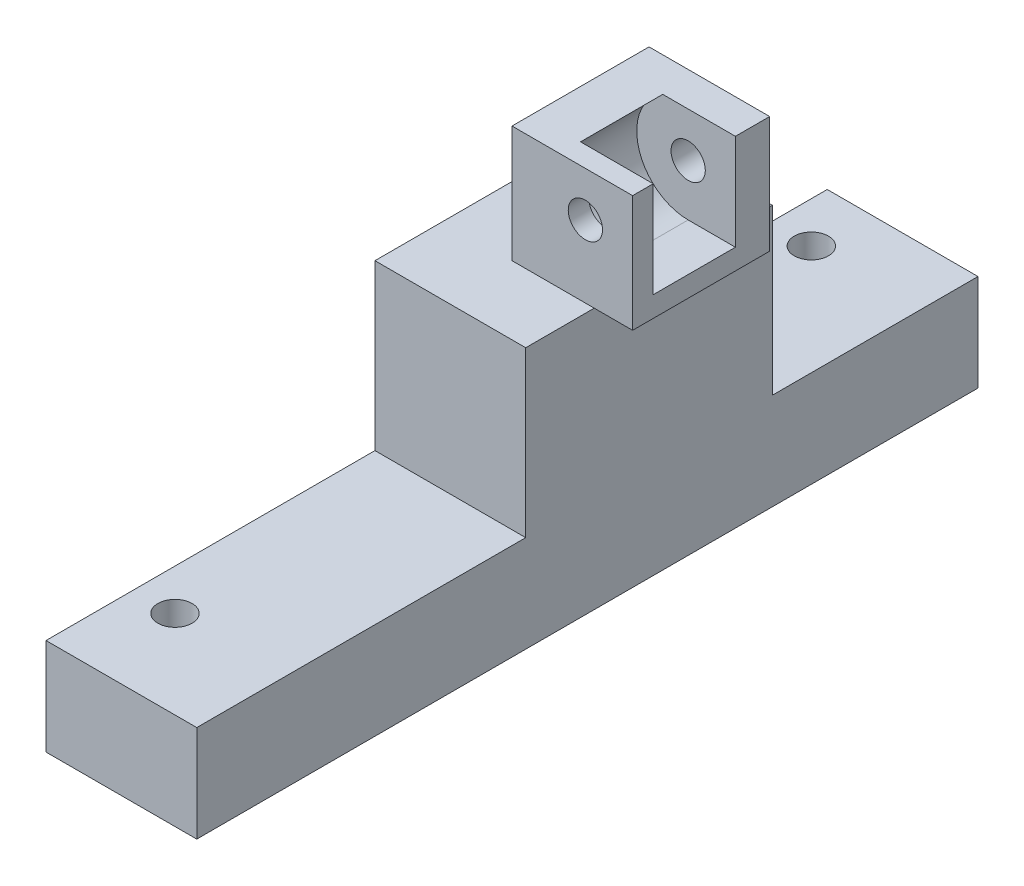
ISO-10303-21;
HEADER;
FILE_DESCRIPTION(('STEP AP214'),'2;1');
FILE_NAME('part.step','',(''),(''),'','','');
FILE_SCHEMA(('AUTOMOTIVE_DESIGN { 1 0 10303 214 1 1 1 1 }'));
ENDSEC;
DATA;
#1=APPLICATION_CONTEXT('core data for automotive mechanical design processes');
#2=APPLICATION_PROTOCOL_DEFINITION('international standard','automotive_design',2000,#1);
#3=PRODUCT_CONTEXT('',#1,'mechanical');
#4=PRODUCT('Part','Part','',(#3));
#5=PRODUCT_RELATED_PRODUCT_CATEGORY('part','',(#4));
#6=PRODUCT_DEFINITION_FORMATION('','',#4);
#7=PRODUCT_DEFINITION_CONTEXT('part definition',#1,'design');
#8=PRODUCT_DEFINITION('design','',#6,#7);
#9=PRODUCT_DEFINITION_SHAPE('','',#8);
#10=(LENGTH_UNIT() NAMED_UNIT(*) SI_UNIT(.MILLI.,.METRE.));
#11=(NAMED_UNIT(*) PLANE_ANGLE_UNIT() SI_UNIT($,.RADIAN.));
#12=(NAMED_UNIT(*) SI_UNIT($,.STERADIAN.) SOLID_ANGLE_UNIT());
#13=UNCERTAINTY_MEASURE_WITH_UNIT(LENGTH_MEASURE(1.E-05),#10,'distance_accuracy_value','');
#14=(GEOMETRIC_REPRESENTATION_CONTEXT(3) GLOBAL_UNCERTAINTY_ASSIGNED_CONTEXT((#13)) GLOBAL_UNIT_ASSIGNED_CONTEXT((#10,
#11,#12)) REPRESENTATION_CONTEXT('',''));
#15=CARTESIAN_POINT('',(0.,0.,0.));
#16=DIRECTION('',(0.,0.,1.));
#17=DIRECTION('',(1.,0.,0.));
#18=AXIS2_PLACEMENT_3D('',#15,#16,#17);
#19=CARTESIAN_POINT('',(0.,352.959436719435,-21.59));
#20=DIRECTION('',(0.,-1.,0.));
#21=DIRECTION('',(0.,0.,-1.));
#22=AXIS2_PLACEMENT_3D('',#19,#20,#21);
#23=PLANE('',#22);
#24=DIRECTION('',(1.,0.,0.));
#25=VECTOR('',#24,1.);
#26=CARTESIAN_POINT('',(-814.935825879218,352.959436719435,3.81));
#27=LINE('',#26,#25);
#28=CARTESIAN_POINT('',(-799.695825879218,352.959436719435,3.80999999999999));
#29=VERTEX_POINT('',#28);
#30=CARTESIAN_POINT('',(-792.583825879217,352.959436719435,3.81));
#31=VERTEX_POINT('',#30);
#32=EDGE_CURVE('E248',#29,#31,#27,.T.);
#33=ORIENTED_EDGE('',*,*,#32,.F.);
#34=DIRECTION('',(0.,0.,-1.));
#35=VECTOR('',#34,1.);
#36=CARTESIAN_POINT('',(-799.695825879218,352.959436719435,77.47));
#37=LINE('',#36,#35);
#38=CARTESIAN_POINT('',(-799.695825879218,352.959436719435,-21.59));
#39=VERTEX_POINT('',#38);
#40=EDGE_CURVE('E176',#29,#39,#37,.T.);
#41=ORIENTED_EDGE('',*,*,#40,.T.);
#42=DIRECTION('',(1.,0.,0.));
#43=VECTOR('',#42,1.);
#44=CARTESIAN_POINT('',(0.,352.959436719435,-21.59));
#45=LINE('',#44,#43);
#46=CARTESIAN_POINT('',(-792.583825879217,352.959436719435,-21.59));
#47=VERTEX_POINT('',#46);
#48=EDGE_CURVE('E280',#39,#47,#45,.T.);
#49=ORIENTED_EDGE('',*,*,#48,.T.);
#50=DIRECTION('',(0.,0.,1.));
#51=VECTOR('',#50,1.);
#52=CARTESIAN_POINT('',(-792.583825879217,352.959436719435,-21.59));
#53=LINE('',#52,#51);
#54=EDGE_CURVE('E302',#47,#31,#53,.T.);
#55=ORIENTED_EDGE('',*,*,#54,.T.);
#56=EDGE_LOOP('',(#33,#41,#49,#55));
#57=FACE_BOUND('',#56,.T.);
#58=ADVANCED_FACE('F47',(#57),#23,.T.);
#59=CARTESIAN_POINT('',(-801.338321143161,366.294436719436,-21.59));
#60=DIRECTION('',(0.,0.,1.));
#61=DIRECTION('',(1.,0.,0.));
#62=AXIS2_PLACEMENT_3D('',#59,#60,#61);
#63=CYLINDRICAL_SURFACE('',#62,9.52500000000037);
#64=CARTESIAN_POINT('',(-801.33832114316,366.294436719435,-15.24));
#65=DIRECTION('',(0.,0.,1.));
#66=DIRECTION('',(1.,0.,0.));
#67=AXIS2_PLACEMENT_3D('',#64,#65,#66);
#68=CIRCLE('',#67,9.52500000000007);
#69=CARTESIAN_POINT('',(-801.33832114316,356.769436719435,-15.24));
#70=VERTEX_POINT('',#69);
#71=CARTESIAN_POINT('',(-806.045825879218,374.574836719435,-15.24));
#72=VERTEX_POINT('',#71);
#73=EDGE_CURVE('E214',#70,#72,#68,.F.);
#74=ORIENTED_EDGE('',*,*,#73,.T.);
#75=DIRECTION('',(0.,0.,1.));
#76=VECTOR('',#75,1.);
#77=CARTESIAN_POINT('',(-806.045825879218,374.574836719435,-21.59));
#78=LINE('',#77,#76);
#79=CARTESIAN_POINT('',(-806.045825879218,374.574836719435,0.));
#80=VERTEX_POINT('',#79);
#81=EDGE_CURVE('E289',#72,#80,#78,.T.);
#82=ORIENTED_EDGE('',*,*,#81,.T.);
#83=CARTESIAN_POINT('',(-801.338321143161,366.294436719436,0.));
#84=DIRECTION('',(0.,0.,1.));
#85=DIRECTION('',(1.,0.,0.));
#86=AXIS2_PLACEMENT_3D('',#83,#84,#85);
#87=CIRCLE('',#86,9.52500000000037);
#88=CARTESIAN_POINT('',(-801.33832114316,356.769436719435,0.));
#89=VERTEX_POINT('',#88);
#90=EDGE_CURVE('E270',#89,#80,#87,.F.);
#91=ORIENTED_EDGE('',*,*,#90,.F.);
#92=DIRECTION('',(0.,0.,1.));
#93=VECTOR('',#92,1.);
#94=CARTESIAN_POINT('',(-801.33832114316,356.769436719435,-21.59));
#95=LINE('',#94,#93);
#96=EDGE_CURVE('E296',#70,#89,#95,.T.);
#97=ORIENTED_EDGE('',*,*,#96,.F.);
#98=EDGE_LOOP('',(#74,#82,#91,#97));
#99=FACE_BOUND('',#98,.T.);
#100=ADVANCED_FACE('F49',(#99),#63,.F.);
#101=CARTESIAN_POINT('',(0.,356.769436719435,-21.59));
#102=DIRECTION('',(0.,1.,0.));
#103=DIRECTION('',(0.,0.,1.));
#104=AXIS2_PLACEMENT_3D('',#101,#102,#103);
#105=PLANE('',#104);
#106=DIRECTION('',(-1.,0.,0.));
#107=VECTOR('',#106,1.);
#108=CARTESIAN_POINT('',(-792.583825879217,356.769436719435,-15.24));
#109=LINE('',#108,#107);
#110=CARTESIAN_POINT('',(-792.583825879217,356.769436719435,-15.24));
#111=VERTEX_POINT('',#110);
#112=EDGE_CURVE('E222',#111,#70,#109,.T.);
#113=ORIENTED_EDGE('',*,*,#112,.T.);
#114=ORIENTED_EDGE('',*,*,#96,.T.);
#115=DIRECTION('',(-1.,0.,0.));
#116=VECTOR('',#115,1.);
#117=CARTESIAN_POINT('',(0.,356.769436719435,0.));
#118=LINE('',#117,#116);
#119=CARTESIAN_POINT('',(-792.583825879217,356.769436719435,0.));
#120=VERTEX_POINT('',#119);
#121=EDGE_CURVE('E276',#120,#89,#118,.T.);
#122=ORIENTED_EDGE('',*,*,#121,.F.);
#123=DIRECTION('',(0.,0.,1.));
#124=VECTOR('',#123,1.);
#125=CARTESIAN_POINT('',(-792.583825879217,356.769436719435,-21.59));
#126=LINE('',#125,#124);
#127=EDGE_CURVE('E299',#111,#120,#126,.T.);
#128=ORIENTED_EDGE('',*,*,#127,.F.);
#129=EDGE_LOOP('',(#113,#114,#122,#128));
#130=FACE_BOUND('',#129,.T.);
#131=ADVANCED_FACE('F445',(#130),#105,.T.);
#132=CARTESIAN_POINT('',(-792.583825879217,0.,-21.59));
#133=DIRECTION('',(-1.,0.,0.));
#134=DIRECTION('',(0.,0.,1.));
#135=AXIS2_PLACEMENT_3D('',#132,#133,#134);
#136=PLANE('',#135);
#137=DIRECTION('',(0.,-1.,0.));
#138=VECTOR('',#137,1.);
#139=CARTESIAN_POINT('',(-792.583825879217,0.,-21.59));
#140=LINE('',#139,#138);
#141=CARTESIAN_POINT('',(-792.583825879217,374.574836719435,-21.59));
#142=VERTEX_POINT('',#141);
#143=EDGE_CURVE('E285',#142,#47,#140,.T.);
#144=ORIENTED_EDGE('',*,*,#143,.F.);
#145=DIRECTION('',(0.,0.,-1.));
#146=VECTOR('',#145,1.);
#147=CARTESIAN_POINT('',(-792.583825879217,374.574836719435,14.0880762649637));
#148=LINE('',#147,#146);
#149=CARTESIAN_POINT('',(-792.583825879217,374.574836719435,-15.24));
#150=VERTEX_POINT('',#149);
#151=EDGE_CURVE('E221',#150,#142,#148,.T.);
#152=ORIENTED_EDGE('',*,*,#151,.F.);
#153=DIRECTION('',(0.,-1.,0.));
#154=VECTOR('',#153,1.);
#155=CARTESIAN_POINT('',(-792.583825879217,356.769436719435,-15.24));
#156=LINE('',#155,#154);
#157=EDGE_CURVE('E225',#150,#111,#156,.T.);
#158=ORIENTED_EDGE('',*,*,#157,.T.);
#159=ORIENTED_EDGE('',*,*,#127,.T.);
#160=DIRECTION('',(0.,1.,0.));
#161=VECTOR('',#160,1.);
#162=CARTESIAN_POINT('',(-792.583825879217,352.959436719435,0.));
#163=LINE('',#162,#161);
#164=CARTESIAN_POINT('',(-792.583825879217,374.574836719435,0.));
#165=VERTEX_POINT('',#164);
#166=EDGE_CURVE('E240',#120,#165,#163,.T.);
#167=ORIENTED_EDGE('',*,*,#166,.T.);
#168=DIRECTION('',(0.,0.,-1.));
#169=VECTOR('',#168,1.);
#170=CARTESIAN_POINT('',(-792.583825879217,374.574836719435,3.81));
#171=LINE('',#170,#169);
#172=CARTESIAN_POINT('',(-792.583825879217,374.574836719435,3.81));
#173=VERTEX_POINT('',#172);
#174=EDGE_CURVE('E261',#173,#165,#171,.T.);
#175=ORIENTED_EDGE('',*,*,#174,.F.);
#176=DIRECTION('',(0.,1.,0.));
#177=VECTOR('',#176,1.);
#178=CARTESIAN_POINT('',(-792.583825879217,352.959436719435,3.81));
#179=LINE('',#178,#177);
#180=EDGE_CURVE('E254',#31,#173,#179,.T.);
#181=ORIENTED_EDGE('',*,*,#180,.F.);
#182=ORIENTED_EDGE('',*,*,#54,.F.);
#183=EDGE_LOOP('',(#144,#152,#158,#159,#167,#175,#181,#182));
#184=FACE_BOUND('',#183,.T.);
#185=ADVANCED_FACE('F449',(#184),#136,.F.);
#186=CARTESIAN_POINT('',(-814.935825879218,0.,-21.59));
#187=DIRECTION('',(-1.,0.,0.));
#188=DIRECTION('',(0.,0.,1.));
#189=AXIS2_PLACEMENT_3D('',#186,#187,#188);
#190=PLANE('',#189);
#191=DIRECTION('',(0.,0.,1.));
#192=VECTOR('',#191,1.);
#193=CARTESIAN_POINT('',(-814.935825879218,352.959436719435,-21.59));
#194=LINE('',#193,#192);
#195=CARTESIAN_POINT('',(-814.935825879218,352.959436719435,-21.59));
#196=VERTEX_POINT('',#195);
#197=CARTESIAN_POINT('',(-814.935825879218,352.959436719435,3.81));
#198=VERTEX_POINT('',#197);
#199=EDGE_CURVE('E306',#196,#198,#194,.T.);
#200=ORIENTED_EDGE('',*,*,#199,.T.);
#201=DIRECTION('',(0.,-1.,0.));
#202=VECTOR('',#201,1.);
#203=CARTESIAN_POINT('',(-814.935825879218,352.959436719435,3.81));
#204=LINE('',#203,#202);
#205=CARTESIAN_POINT('',(-814.935825879218,374.574836719435,3.81));
#206=VERTEX_POINT('',#205);
#207=EDGE_CURVE('E244',#206,#198,#204,.T.);
#208=ORIENTED_EDGE('',*,*,#207,.F.);
#209=DIRECTION('',(0.,0.,1.));
#210=VECTOR('',#209,1.);
#211=CARTESIAN_POINT('',(-814.935825879218,374.574836719435,-21.59));
#212=LINE('',#211,#210);
#213=CARTESIAN_POINT('',(-814.935825879218,374.574836719435,-21.59));
#214=VERTEX_POINT('',#213);
#215=EDGE_CURVE('E310',#214,#206,#212,.T.);
#216=ORIENTED_EDGE('',*,*,#215,.F.);
#217=DIRECTION('',(0.,-1.,0.));
#218=VECTOR('',#217,1.);
#219=CARTESIAN_POINT('',(-814.935825879218,0.,-21.59));
#220=LINE('',#219,#218);
#221=EDGE_CURVE('E275',#214,#196,#220,.T.);
#222=ORIENTED_EDGE('',*,*,#221,.T.);
#223=EDGE_LOOP('',(#200,#208,#216,#222));
#224=FACE_BOUND('',#223,.T.);
#225=ADVANCED_FACE('F354',(#224),#190,.T.);
#226=CARTESIAN_POINT('',(0.,374.574836719435,-21.59));
#227=DIRECTION('',(0.,-1.,0.));
#228=DIRECTION('',(0.,0.,-1.));
#229=AXIS2_PLACEMENT_3D('',#226,#227,#228);
#230=PLANE('',#229);
#231=ORIENTED_EDGE('',*,*,#215,.T.);
#232=DIRECTION('',(-1.,0.,0.));
#233=VECTOR('',#232,1.);
#234=CARTESIAN_POINT('',(-814.935825879218,374.574836719435,3.81));
#235=LINE('',#234,#233);
#236=EDGE_CURVE('E257',#173,#206,#235,.T.);
#237=ORIENTED_EDGE('',*,*,#236,.F.);
#238=ORIENTED_EDGE('',*,*,#174,.T.);
#239=DIRECTION('',(-1.,0.,0.));
#240=VECTOR('',#239,1.);
#241=CARTESIAN_POINT('',(-814.935825879218,374.574836719435,0.));
#242=LINE('',#241,#240);
#243=EDGE_CURVE('E249',#165,#80,#242,.T.);
#244=ORIENTED_EDGE('',*,*,#243,.T.);
#245=ORIENTED_EDGE('',*,*,#81,.F.);
#246=DIRECTION('',(1.,0.,0.));
#247=VECTOR('',#246,1.);
#248=CARTESIAN_POINT('',(-792.583825879217,374.574836719435,-15.24));
#249=LINE('',#248,#247);
#250=EDGE_CURVE('E229',#72,#150,#249,.T.);
#251=ORIENTED_EDGE('',*,*,#250,.T.);
#252=ORIENTED_EDGE('',*,*,#151,.T.);
#253=DIRECTION('',(1.,0.,0.));
#254=VECTOR('',#253,1.);
#255=CARTESIAN_POINT('',(0.,374.574836719435,-21.59));
#256=LINE('',#255,#254);
#257=EDGE_CURVE('E271',#214,#142,#256,.T.);
#258=ORIENTED_EDGE('',*,*,#257,.F.);
#259=EDGE_LOOP('',(#231,#237,#238,#244,#245,#251,#252,#258));
#260=FACE_BOUND('',#259,.T.);
#261=ADVANCED_FACE('F451',(#260),#230,.F.);
#262=CARTESIAN_POINT('',(0.,0.,-21.59));
#263=DIRECTION('',(0.,0.,1.));
#264=DIRECTION('',(1.,0.,0.));
#265=AXIS2_PLACEMENT_3D('',#262,#263,#264);
#266=PLANE('',#265);
#267=ORIENTED_EDGE('',*,*,#257,.T.);
#268=ORIENTED_EDGE('',*,*,#143,.T.);
#269=ORIENTED_EDGE('',*,*,#48,.F.);
#270=EDGE_CURVE('E281',#196,#39,#45,.T.);
#271=ORIENTED_EDGE('',*,*,#270,.F.);
#272=ORIENTED_EDGE('',*,*,#221,.F.);
#273=EDGE_LOOP('',(#267,#268,#269,#271,#272));
#274=FACE_BOUND('',#273,.T.);
#275=CARTESIAN_POINT('',(-801.33832114316,366.294436719435,-21.59));
#276=DIRECTION('',(0.,0.,-1.));
#277=DIRECTION('',(-1.,0.,0.));
#278=AXIS2_PLACEMENT_3D('',#275,#276,#277);
#279=CIRCLE('',#278,3.17500000000032);
#280=CARTESIAN_POINT('',(-804.513321143161,366.294436719435,-21.59));
#281=VERTEX_POINT('',#280);
#282=EDGE_CURVE('E209',#281,#281,#279,.T.);
#283=ORIENTED_EDGE('',*,*,#282,.F.);
#284=EDGE_LOOP('',(#283));
#285=FACE_BOUND('',#284,.T.);
#286=ADVANCED_FACE('F358',(#274,#285),#266,.F.);
#287=CARTESIAN_POINT('',(0.,0.,3.81));
#288=DIRECTION('',(0.,0.,-1.));
#289=DIRECTION('',(-1.,0.,0.));
#290=AXIS2_PLACEMENT_3D('',#287,#288,#289);
#291=PLANE('',#290);
#292=ORIENTED_EDGE('',*,*,#207,.T.);
#293=EDGE_CURVE('E250',#198,#29,#27,.T.);
#294=ORIENTED_EDGE('',*,*,#293,.T.);
#295=ORIENTED_EDGE('',*,*,#32,.T.);
#296=ORIENTED_EDGE('',*,*,#180,.T.);
#297=ORIENTED_EDGE('',*,*,#236,.T.);
#298=EDGE_LOOP('',(#292,#294,#295,#296,#297));
#299=FACE_BOUND('',#298,.T.);
#300=CARTESIAN_POINT('',(-801.338321143161,366.294436719435,3.81));
#301=DIRECTION('',(0.,0.,1.));
#302=DIRECTION('',(1.,0.,0.));
#303=AXIS2_PLACEMENT_3D('',#300,#301,#302);
#304=CIRCLE('',#303,3.17500000000008);
#305=CARTESIAN_POINT('',(-804.513321143161,366.294436719435,3.81));
#306=VERTEX_POINT('',#305);
#307=EDGE_CURVE('E236',#306,#306,#304,.T.);
#308=ORIENTED_EDGE('',*,*,#307,.F.);
#309=EDGE_LOOP('',(#308));
#310=FACE_BOUND('',#309,.T.);
#311=ADVANCED_FACE('F349',(#299,#310),#291,.F.);
#312=CARTESIAN_POINT('',(0.,0.,0.));
#313=DIRECTION('',(0.,0.,-1.));
#314=DIRECTION('',(-1.,0.,0.));
#315=AXIS2_PLACEMENT_3D('',#312,#313,#314);
#316=PLANE('',#315);
#317=ORIENTED_EDGE('',*,*,#121,.T.);
#318=ORIENTED_EDGE('',*,*,#90,.T.);
#319=ORIENTED_EDGE('',*,*,#243,.F.);
#320=ORIENTED_EDGE('',*,*,#166,.F.);
#321=EDGE_LOOP('',(#317,#318,#319,#320));
#322=FACE_BOUND('',#321,.T.);
#323=CARTESIAN_POINT('',(-801.338321143161,366.294436719435,0.));
#324=DIRECTION('',(0.,0.,1.));
#325=DIRECTION('',(1.,0.,0.));
#326=AXIS2_PLACEMENT_3D('',#323,#324,#325);
#327=CIRCLE('',#326,3.17500000000008);
#328=CARTESIAN_POINT('',(-804.513321143161,366.294436719435,0.));
#329=VERTEX_POINT('',#328);
#330=EDGE_CURVE('E218',#329,#329,#327,.T.);
#331=ORIENTED_EDGE('',*,*,#330,.T.);
#332=EDGE_LOOP('',(#331));
#333=FACE_BOUND('',#332,.T.);
#334=ADVANCED_FACE('F467',(#322,#333),#316,.T.);
#335=CARTESIAN_POINT('',(-801.338321143161,366.294436719435,3.81));
#336=DIRECTION('',(0.,0.,-1.));
#337=DIRECTION('',(-1.,0.,0.));
#338=AXIS2_PLACEMENT_3D('',#335,#336,#337);
#339=CYLINDRICAL_SURFACE('',#338,3.17500000000008);
#340=CARTESIAN_POINT('',(-804.513321143161,366.294436719435,3.81));
#341=CARTESIAN_POINT('',(-804.513321143161,366.294436719435,3.7703125));
#342=CARTESIAN_POINT('',(-804.513321143161,366.294436719435,3.730625));
#343=CARTESIAN_POINT('',(-804.513321143161,366.294436719435,3.65125));
#344=CARTESIAN_POINT('',(-804.513321143161,366.294436719435,3.6115625));
#345=CARTESIAN_POINT('',(-804.513321143161,366.294436719435,3.5321875));
#346=CARTESIAN_POINT('',(-804.513321143161,366.294436719435,3.4925));
#347=CARTESIAN_POINT('',(-804.513321143161,366.294436719435,3.413125));
#348=CARTESIAN_POINT('',(-804.513321143161,366.294436719435,3.3734375));
#349=CARTESIAN_POINT('',(-804.513321143161,366.294436719435,3.2940625));
#350=CARTESIAN_POINT('',(-804.513321143161,366.294436719435,3.254375));
#351=CARTESIAN_POINT('',(-804.513321143161,366.294436719435,3.175));
#352=CARTESIAN_POINT('',(-804.513321143161,366.294436719435,3.1353125));
#353=CARTESIAN_POINT('',(-804.513321143161,366.294436719435,3.0559375));
#354=CARTESIAN_POINT('',(-804.513321143161,366.294436719435,3.01625));
#355=CARTESIAN_POINT('',(-804.513321143161,366.294436719435,2.936875));
#356=CARTESIAN_POINT('',(-804.513321143161,366.294436719435,2.8971875));
#357=CARTESIAN_POINT('',(-804.513321143161,366.294436719435,2.8178125));
#358=CARTESIAN_POINT('',(-804.513321143161,366.294436719435,2.778125));
#359=CARTESIAN_POINT('',(-804.513321143161,366.294436719435,2.69875));
#360=CARTESIAN_POINT('',(-804.513321143161,366.294436719435,2.6590625));
#361=CARTESIAN_POINT('',(-804.513321143161,366.294436719435,2.5796875));
#362=CARTESIAN_POINT('',(-804.513321143161,366.294436719435,2.54));
#363=CARTESIAN_POINT('',(-804.513321143161,366.294436719435,2.460625));
#364=CARTESIAN_POINT('',(-804.513321143161,366.294436719435,2.4209375));
#365=CARTESIAN_POINT('',(-804.513321143161,366.294436719435,2.3415625));
#366=CARTESIAN_POINT('',(-804.513321143161,366.294436719435,2.301875));
#367=CARTESIAN_POINT('',(-804.513321143161,366.294436719435,2.2225));
#368=CARTESIAN_POINT('',(-804.513321143161,366.294436719435,2.1828125));
#369=CARTESIAN_POINT('',(-804.513321143161,366.294436719435,2.1034375));
#370=CARTESIAN_POINT('',(-804.513321143161,366.294436719435,2.06375));
#371=CARTESIAN_POINT('',(-804.513321143161,366.294436719435,1.984375));
#372=CARTESIAN_POINT('',(-804.513321143161,366.294436719435,1.9446875));
#373=CARTESIAN_POINT('',(-804.513321143161,366.294436719435,1.8653125));
#374=CARTESIAN_POINT('',(-804.513321143161,366.294436719435,1.825625));
#375=CARTESIAN_POINT('',(-804.513321143161,366.294436719435,1.74625));
#376=CARTESIAN_POINT('',(-804.513321143161,366.294436719435,1.7065625));
#377=CARTESIAN_POINT('',(-804.513321143161,366.294436719435,1.6271875));
#378=CARTESIAN_POINT('',(-804.513321143161,366.294436719435,1.5875));
#379=CARTESIAN_POINT('',(-804.513321143161,366.294436719435,1.508125));
#380=CARTESIAN_POINT('',(-804.513321143161,366.294436719435,1.4684375));
#381=CARTESIAN_POINT('',(-804.513321143161,366.294436719435,1.3890625));
#382=CARTESIAN_POINT('',(-804.513321143161,366.294436719435,1.349375));
#383=CARTESIAN_POINT('',(-804.513321143161,366.294436719435,1.27));
#384=CARTESIAN_POINT('',(-804.513321143161,366.294436719435,1.2303125));
#385=CARTESIAN_POINT('',(-804.513321143161,366.294436719435,1.1509375));
#386=CARTESIAN_POINT('',(-804.513321143161,366.294436719435,1.11125));
#387=CARTESIAN_POINT('',(-804.513321143161,366.294436719435,1.031875));
#388=CARTESIAN_POINT('',(-804.513321143161,366.294436719435,0.9921875));
#389=CARTESIAN_POINT('',(-804.513321143161,366.294436719435,0.9128125));
#390=CARTESIAN_POINT('',(-804.513321143161,366.294436719435,0.873125));
#391=CARTESIAN_POINT('',(-804.513321143161,366.294436719435,0.79375));
#392=CARTESIAN_POINT('',(-804.513321143161,366.294436719435,0.7540625));
#393=CARTESIAN_POINT('',(-804.513321143161,366.294436719435,0.6746875));
#394=CARTESIAN_POINT('',(-804.513321143161,366.294436719435,0.635));
#395=CARTESIAN_POINT('',(-804.513321143161,366.294436719435,0.555625));
#396=CARTESIAN_POINT('',(-804.513321143161,366.294436719435,0.5159375));
#397=CARTESIAN_POINT('',(-804.513321143161,366.294436719435,0.4365625));
#398=CARTESIAN_POINT('',(-804.513321143161,366.294436719435,0.396875));
#399=CARTESIAN_POINT('',(-804.513321143161,366.294436719435,0.3175));
#400=CARTESIAN_POINT('',(-804.513321143161,366.294436719435,0.2778125));
#401=CARTESIAN_POINT('',(-804.513321143161,366.294436719435,0.1984375));
#402=CARTESIAN_POINT('',(-804.513321143161,366.294436719435,0.15875));
#403=CARTESIAN_POINT('',(-804.513321143161,366.294436719435,0.0793749999999999));
#404=CARTESIAN_POINT('',(-804.513321143161,366.294436719435,0.0396874999999999));
#405=CARTESIAN_POINT('',(-804.513321143161,366.294436719435,0.));
#406=B_SPLINE_CURVE_WITH_KNOTS('',3,(#340,#341,#342,#343,#344,#345,#346,#347,#348,#349,#350,
#351,#352,#353,#354,#355,#356,#357,#358,#359,#360,#361,#362,#363,#364,#365,#366,#367,#368,#369,
#370,#371,#372,#373,#374,#375,#376,#377,#378,#379,#380,#381,#382,#383,#384,#385,#386,#387,#388,
#389,#390,#391,#392,#393,#394,#395,#396,#397,#398,#399,#400,#401,#402,#403,#404,#405),
.UNSPECIFIED.,.F.,.F.,(4,2,2,2,2,2,2,2,2,2,2,2,2,2,2,2,2,2,2,2,2,2,2,2,2,2,2,2,2,2,2,2,4),(0.,
0.1190625,0.238125,0.3571875,0.47625,0.595312499999999,0.714375,0.833437499999999,
0.952499999999999,1.0715625,1.190625,1.3096875,1.42875,1.5478125,1.666875,1.7859375,1.905,
2.0240625,2.143125,2.2621875,2.38125,2.5003125,2.619375,2.7384375,2.8575,2.9765625,3.095625,
3.2146875,3.33375,3.4528125,3.571875,3.6909375,3.81),.UNSPECIFIED.);
#407=EDGE_CURVE('BSEAM486',#306,#329,#406,.T.);
#408=ORIENTED_EDGE('',*,*,#307,.T.);
#409=ORIENTED_EDGE('',*,*,#330,.F.);
#410=ORIENTED_EDGE('',*,*,#407,.T.);
#411=ORIENTED_EDGE('',*,*,#407,.F.);
#412=EDGE_LOOP('',(#408,#410,#409,#411));
#413=FACE_BOUND('',#412,.T.);
#414=ADVANCED_FACE('F486',(#413),#339,.F.);
#415=CARTESIAN_POINT('',(-801.33832114316,366.294436719435,14.0880762649637));
#416=DIRECTION('',(0.,0.,-1.));
#417=DIRECTION('',(-1.,0.,0.));
#418=AXIS2_PLACEMENT_3D('',#415,#416,#417);
#419=CYLINDRICAL_SURFACE('',#418,3.17500000000032);
#420=ORIENTED_EDGE('',*,*,#282,.T.);
#421=EDGE_LOOP('',(#420));
#422=FACE_BOUND('',#421,.T.);
#423=CARTESIAN_POINT('',(-801.33832114316,366.294436719435,-15.24));
#424=DIRECTION('',(0.,0.,1.));
#425=DIRECTION('',(1.,0.,0.));
#426=AXIS2_PLACEMENT_3D('',#423,#424,#425);
#427=CIRCLE('',#426,3.17500000000032);
#428=CARTESIAN_POINT('',(-798.16332114316,366.294436719435,-15.24));
#429=VERTEX_POINT('',#428);
#430=EDGE_CURVE('E213',#429,#429,#427,.F.);
#431=ORIENTED_EDGE('',*,*,#430,.F.);
#432=EDGE_LOOP('',(#431));
#433=FACE_BOUND('',#432,.T.);
#434=ADVANCED_FACE('F491',(#422,#433),#419,.F.);
#435=CARTESIAN_POINT('',(-801.338321143161,358.014036719435,-15.24));
#436=DIRECTION('',(0.,0.,1.));
#437=DIRECTION('',(1.,0.,0.));
#438=AXIS2_PLACEMENT_3D('',#435,#436,#437);
#439=PLANE('',#438);
#440=ORIENTED_EDGE('',*,*,#112,.F.);
#441=ORIENTED_EDGE('',*,*,#157,.F.);
#442=ORIENTED_EDGE('',*,*,#250,.F.);
#443=ORIENTED_EDGE('',*,*,#73,.F.);
#444=EDGE_LOOP('',(#440,#441,#442,#443));
#445=FACE_BOUND('',#444,.T.);
#446=ORIENTED_EDGE('',*,*,#430,.T.);
#447=EDGE_LOOP('',(#446));
#448=FACE_BOUND('',#447,.T.);
#449=ADVANCED_FACE('F476',(#445,#448),#439,.T.);
#450=CARTESIAN_POINT('',(0.,352.959436719435,0.));
#451=DIRECTION('',(0.,-1.,0.));
#452=DIRECTION('',(0.,0.,-1.));
#453=AXIS2_PLACEMENT_3D('',#450,#451,#452);
#454=PLANE('',#453);
#455=CARTESIAN_POINT('',(-799.695825879218,352.959436719435,-29.21));
#456=VERTEX_POINT('',#455);
#457=EDGE_CURVE('E200',#39,#456,#37,.T.);
#458=ORIENTED_EDGE('',*,*,#457,.T.);
#459=DIRECTION('',(-1.,0.,0.));
#460=VECTOR('',#459,1.);
#461=CARTESIAN_POINT('',(-792.583825879217,352.959436719435,-29.21));
#462=LINE('',#461,#460);
#463=CARTESIAN_POINT('',(-827.635825879218,352.959436719435,-29.21));
#464=VERTEX_POINT('',#463);
#465=EDGE_CURVE('E360',#456,#464,#462,.T.);
#466=ORIENTED_EDGE('',*,*,#465,.T.);
#467=DIRECTION('',(0.,0.,-1.));
#468=VECTOR('',#467,1.);
#469=CARTESIAN_POINT('',(-827.635825879218,352.959436719435,77.47));
#470=LINE('',#469,#468);
#471=CARTESIAN_POINT('',(-827.635825879218,352.959436719435,16.51));
#472=VERTEX_POINT('',#471);
#473=EDGE_CURVE('E334',#472,#464,#470,.T.);
#474=ORIENTED_EDGE('',*,*,#473,.F.);
#475=DIRECTION('',(-1.,0.,0.));
#476=VECTOR('',#475,1.);
#477=CARTESIAN_POINT('',(-792.583825879217,352.959436719435,16.51));
#478=LINE('',#477,#476);
#479=CARTESIAN_POINT('',(-799.695825879218,352.959436719435,16.51));
#480=VERTEX_POINT('',#479);
#481=EDGE_CURVE('E323',#480,#472,#478,.T.);
#482=ORIENTED_EDGE('',*,*,#481,.F.);
#483=EDGE_CURVE('E193',#480,#29,#37,.T.);
#484=ORIENTED_EDGE('',*,*,#483,.T.);
#485=ORIENTED_EDGE('',*,*,#293,.F.);
#486=ORIENTED_EDGE('',*,*,#199,.F.);
#487=ORIENTED_EDGE('',*,*,#270,.T.);
#488=EDGE_LOOP('',(#458,#466,#474,#482,#484,#485,#486,#487));
#489=FACE_BOUND('',#488,.T.);
#490=ADVANCED_FACE('F331',(#489),#454,.F.);
#491=CARTESIAN_POINT('',(-827.635825879218,157.120079219208,77.47));
#492=DIRECTION('',(1.,0.,0.));
#493=DIRECTION('',(0.,0.,-1.));
#494=AXIS2_PLACEMENT_3D('',#491,#492,#493);
#495=PLANE('',#494);
#496=ORIENTED_EDGE('',*,*,#473,.T.);
#497=DIRECTION('',(0.,1.,0.));
#498=VECTOR('',#497,1.);
#499=CARTESIAN_POINT('',(-827.635825879218,352.959436719435,-29.21));
#500=LINE('',#499,#498);
#501=CARTESIAN_POINT('',(-827.635825879218,322.479436719435,-29.21));
#502=VERTEX_POINT('',#501);
#503=EDGE_CURVE('E184',#502,#464,#500,.T.);
#504=ORIENTED_EDGE('',*,*,#503,.F.);
#505=DIRECTION('',(0.,0.,1.));
#506=VECTOR('',#505,1.);
#507=CARTESIAN_POINT('',(-827.635825879218,322.479436719435,-67.31));
#508=LINE('',#507,#506);
#509=CARTESIAN_POINT('',(-827.635825879218,322.479436719435,-67.31));
#510=VERTEX_POINT('',#509);
#511=EDGE_CURVE('E168',#510,#502,#508,.T.);
#512=ORIENTED_EDGE('',*,*,#511,.F.);
#513=DIRECTION('',(0.,1.,0.));
#514=VECTOR('',#513,1.);
#515=CARTESIAN_POINT('',(-827.635825879218,157.120079219208,-67.31));
#516=LINE('',#515,#514);
#517=CARTESIAN_POINT('',(-827.635825879218,304.5714,-67.31));
#518=VERTEX_POINT('',#517);
#519=EDGE_CURVE('E183',#518,#510,#516,.T.);
#520=ORIENTED_EDGE('',*,*,#519,.F.);
#521=DIRECTION('',(0.,0.,1.));
#522=VECTOR('',#521,1.);
#523=CARTESIAN_POINT('',(-827.635825879218,304.5714,77.47));
#524=LINE('',#523,#522);
#525=CARTESIAN_POINT('',(-827.635825879218,304.5714,77.47));
#526=VERTEX_POINT('',#525);
#527=EDGE_CURVE('E204',#518,#526,#524,.T.);
#528=ORIENTED_EDGE('',*,*,#527,.T.);
#529=DIRECTION('',(0.,1.,0.));
#530=VECTOR('',#529,1.);
#531=CARTESIAN_POINT('',(-827.635825879218,157.120079219208,77.47));
#532=LINE('',#531,#530);
#533=CARTESIAN_POINT('',(-827.635825879218,322.479436719435,77.47));
#534=VERTEX_POINT('',#533);
#535=EDGE_CURVE('E192',#526,#534,#532,.T.);
#536=ORIENTED_EDGE('',*,*,#535,.T.);
#537=DIRECTION('',(0.,0.,1.));
#538=VECTOR('',#537,1.);
#539=CARTESIAN_POINT('',(-827.635825879218,322.479436719435,16.51));
#540=LINE('',#539,#538);
#541=CARTESIAN_POINT('',(-827.635825879218,322.479436719435,16.51));
#542=VERTEX_POINT('',#541);
#543=EDGE_CURVE('E378',#542,#534,#540,.T.);
#544=ORIENTED_EDGE('',*,*,#543,.F.);
#545=DIRECTION('',(0.,-1.,0.));
#546=VECTOR('',#545,1.);
#547=CARTESIAN_POINT('',(-827.635825879218,352.959436719435,16.51));
#548=LINE('',#547,#546);
#549=EDGE_CURVE('E186',#472,#542,#548,.T.);
#550=ORIENTED_EDGE('',*,*,#549,.F.);
#551=EDGE_LOOP('',(#496,#504,#512,#520,#528,#536,#544,#550));
#552=FACE_BOUND('',#551,.T.);
#553=ADVANCED_FACE('F181',(#552),#495,.F.);
#554=CARTESIAN_POINT('',(-799.695825879218,157.120079219208,77.47));
#555=DIRECTION('',(0.,0.,-1.));
#556=DIRECTION('',(-1.,0.,0.));
#557=AXIS2_PLACEMENT_3D('',#554,#555,#556);
#558=PLANE('',#557);
#559=DIRECTION('',(0.,1.,0.));
#560=VECTOR('',#559,1.);
#561=CARTESIAN_POINT('',(-799.695825879218,157.120079219208,77.47));
#562=LINE('',#561,#560);
#563=CARTESIAN_POINT('',(-799.695825879218,304.5714,77.47));
#564=VERTEX_POINT('',#563);
#565=CARTESIAN_POINT('',(-799.695825879218,322.479436719435,77.47));
#566=VERTEX_POINT('',#565);
#567=EDGE_CURVE('E198',#564,#566,#562,.T.);
#568=ORIENTED_EDGE('',*,*,#567,.T.);
#569=DIRECTION('',(-1.,0.,0.));
#570=VECTOR('',#569,1.);
#571=CARTESIAN_POINT('',(-792.583825879217,322.479436719435,77.47));
#572=LINE('',#571,#570);
#573=EDGE_CURVE('E63',#566,#534,#572,.T.);
#574=ORIENTED_EDGE('',*,*,#573,.T.);
#575=ORIENTED_EDGE('',*,*,#535,.F.);
#576=DIRECTION('',(1.,0.,0.));
#577=VECTOR('',#576,1.);
#578=CARTESIAN_POINT('',(-799.695825879218,304.5714,77.47));
#579=LINE('',#578,#577);
#580=EDGE_CURVE('E207',#526,#564,#579,.T.);
#581=ORIENTED_EDGE('',*,*,#580,.T.);
#582=EDGE_LOOP('',(#568,#574,#575,#581));
#583=FACE_BOUND('',#582,.T.);
#584=ADVANCED_FACE('F372',(#583),#558,.F.);
#585=CARTESIAN_POINT('',(-799.695825879218,157.120079219208,77.47));
#586=DIRECTION('',(1.,0.,0.));
#587=DIRECTION('',(0.,0.,-1.));
#588=AXIS2_PLACEMENT_3D('',#585,#586,#587);
#589=PLANE('',#588);
#590=DIRECTION('',(0.,-1.,0.));
#591=VECTOR('',#590,1.);
#592=CARTESIAN_POINT('',(-799.695825879218,157.120079219208,-29.2099999999999));
#593=LINE('',#592,#591);
#594=CARTESIAN_POINT('',(-799.695825879218,322.479436719435,-29.21));
#595=VERTEX_POINT('',#594);
#596=EDGE_CURVE('E11',#456,#595,#593,.T.);
#597=ORIENTED_EDGE('',*,*,#596,.F.);
#598=ORIENTED_EDGE('',*,*,#457,.F.);
#599=ORIENTED_EDGE('',*,*,#40,.F.);
#600=ORIENTED_EDGE('',*,*,#483,.F.);
#601=DIRECTION('',(0.,1.,0.));
#602=VECTOR('',#601,1.);
#603=CARTESIAN_POINT('',(-799.695825879218,157.120079219208,16.51));
#604=LINE('',#603,#602);
#605=CARTESIAN_POINT('',(-799.695825879218,322.479436719435,16.51));
#606=VERTEX_POINT('',#605);
#607=EDGE_CURVE('E56',#606,#480,#604,.T.);
#608=ORIENTED_EDGE('',*,*,#607,.F.);
#609=DIRECTION('',(0.,0.,-1.));
#610=VECTOR('',#609,1.);
#611=CARTESIAN_POINT('',(-799.695825879218,322.479436719435,77.47));
#612=LINE('',#611,#610);
#613=EDGE_CURVE('E175',#566,#606,#612,.T.);
#614=ORIENTED_EDGE('',*,*,#613,.F.);
#615=ORIENTED_EDGE('',*,*,#567,.F.);
#616=DIRECTION('',(0.,0.,1.));
#617=VECTOR('',#616,1.);
#618=CARTESIAN_POINT('',(-799.695825879218,304.5714,77.47));
#619=LINE('',#618,#617);
#620=CARTESIAN_POINT('',(-799.695825879218,304.5714,-67.31));
#621=VERTEX_POINT('',#620);
#622=EDGE_CURVE('E375',#621,#564,#619,.T.);
#623=ORIENTED_EDGE('',*,*,#622,.F.);
#624=DIRECTION('',(0.,1.,0.));
#625=VECTOR('',#624,1.);
#626=CARTESIAN_POINT('',(-799.695825879218,157.120079219208,-67.31));
#627=LINE('',#626,#625);
#628=CARTESIAN_POINT('',(-799.695825879218,322.479436719435,-67.31));
#629=VERTEX_POINT('',#628);
#630=EDGE_CURVE('E208',#621,#629,#627,.T.);
#631=ORIENTED_EDGE('',*,*,#630,.T.);
#632=DIRECTION('',(0.,0.,-1.));
#633=VECTOR('',#632,1.);
#634=CARTESIAN_POINT('',(-799.695825879218,322.479436719435,77.47));
#635=LINE('',#634,#633);
#636=EDGE_CURVE('E71',#595,#629,#635,.T.);
#637=ORIENTED_EDGE('',*,*,#636,.F.);
#638=EDGE_LOOP('',(#597,#598,#599,#600,#608,#614,#615,#623,#631,#637));
#639=FACE_BOUND('',#638,.T.);
#640=ADVANCED_FACE('F339',(#639),#589,.T.);
#641=CARTESIAN_POINT('',(-799.695825879218,157.120079219208,-67.31));
#642=DIRECTION('',(0.,0.,-1.));
#643=DIRECTION('',(-1.,0.,0.));
#644=AXIS2_PLACEMENT_3D('',#641,#642,#643);
#645=PLANE('',#644);
#646=DIRECTION('',(-1.,0.,0.));
#647=VECTOR('',#646,1.);
#648=CARTESIAN_POINT('',(-799.695825879218,322.479436719435,-67.31));
#649=LINE('',#648,#647);
#650=EDGE_CURVE('E165',#629,#510,#649,.T.);
#651=ORIENTED_EDGE('',*,*,#650,.F.);
#652=ORIENTED_EDGE('',*,*,#630,.F.);
#653=DIRECTION('',(1.,0.,0.));
#654=VECTOR('',#653,1.);
#655=CARTESIAN_POINT('',(-799.695825879218,304.5714,-67.31));
#656=LINE('',#655,#654);
#657=EDGE_CURVE('E190',#518,#621,#656,.T.);
#658=ORIENTED_EDGE('',*,*,#657,.F.);
#659=ORIENTED_EDGE('',*,*,#519,.T.);
#660=EDGE_LOOP('',(#651,#652,#658,#659));
#661=FACE_BOUND('',#660,.T.);
#662=ADVANCED_FACE('F189',(#661),#645,.T.);
#663=CARTESIAN_POINT('',(-820.039,304.5714,61.1628571428577));
#664=DIRECTION('',(0.,1.,0.));
#665=DIRECTION('',(1.,0.,0.));
#666=AXIS2_PLACEMENT_3D('',#663,#664,#665);
#667=PLANE('',#666);
#668=CARTESIAN_POINT('',(-820.039,304.5714,-56.7657142857138));
#669=DIRECTION('',(0.,1.,0.));
#670=DIRECTION('',(0.,0.,1.));
#671=AXIS2_PLACEMENT_3D('',#668,#669,#670);
#672=CIRCLE('',#671,3.17500000000008);
#673=CARTESIAN_POINT('',(-820.039,304.5714,-53.5907142857137));
#674=VERTEX_POINT('',#673);
#675=EDGE_CURVE('E336',#674,#674,#672,.T.);
#676=ORIENTED_EDGE('',*,*,#675,.T.);
#677=EDGE_LOOP('',(#676));
#678=FACE_BOUND('',#677,.T.);
#679=CARTESIAN_POINT('',(-820.039,304.5714,61.1628571428577));
#680=DIRECTION('',(0.,1.,0.));
#681=DIRECTION('',(0.,0.,1.));
#682=AXIS2_PLACEMENT_3D('',#679,#680,#681);
#683=CIRCLE('',#682,3.17500000000008);
#684=CARTESIAN_POINT('',(-820.039,304.5714,64.3378571428577));
#685=VERTEX_POINT('',#684);
#686=EDGE_CURVE('E416',#685,#685,#683,.T.);
#687=ORIENTED_EDGE('',*,*,#686,.T.);
#688=EDGE_LOOP('',(#687));
#689=FACE_BOUND('',#688,.T.);
#690=ORIENTED_EDGE('',*,*,#657,.T.);
#691=ORIENTED_EDGE('',*,*,#622,.T.);
#692=ORIENTED_EDGE('',*,*,#580,.F.);
#693=ORIENTED_EDGE('',*,*,#527,.F.);
#694=EDGE_LOOP('',(#690,#691,#692,#693));
#695=FACE_BOUND('',#694,.T.);
#696=ADVANCED_FACE('F394',(#678,#689,#695),#667,.F.);
#697=CARTESIAN_POINT('',(-792.583825879217,352.959436719435,-29.21));
#698=DIRECTION('',(0.,0.,1.));
#699=DIRECTION('',(0.,-1.,0.));
#700=AXIS2_PLACEMENT_3D('',#697,#698,#699);
#701=PLANE('',#700);
#702=ORIENTED_EDGE('',*,*,#596,.T.);
#703=DIRECTION('',(-1.,0.,0.));
#704=VECTOR('',#703,1.);
#705=CARTESIAN_POINT('',(-792.583825879217,322.479436719435,-29.21));
#706=LINE('',#705,#704);
#707=EDGE_CURVE('E397',#595,#502,#706,.T.);
#708=ORIENTED_EDGE('',*,*,#707,.T.);
#709=ORIENTED_EDGE('',*,*,#503,.T.);
#710=ORIENTED_EDGE('',*,*,#465,.F.);
#711=EDGE_LOOP('',(#702,#708,#709,#710));
#712=FACE_BOUND('',#711,.T.);
#713=ADVANCED_FACE('F396',(#712),#701,.F.);
#714=CARTESIAN_POINT('',(-792.583825879217,322.479436719435,-67.31));
#715=DIRECTION('',(0.,-1.,0.));
#716=DIRECTION('',(0.,0.,-1.));
#717=AXIS2_PLACEMENT_3D('',#714,#715,#716);
#718=PLANE('',#717);
#719=CARTESIAN_POINT('',(-820.039,322.479436719435,-56.7657142857138));
#720=DIRECTION('',(0.,1.,0.));
#721=DIRECTION('',(0.,0.,1.));
#722=AXIS2_PLACEMENT_3D('',#719,#720,#721);
#723=CIRCLE('',#722,3.17500000000008);
#724=CARTESIAN_POINT('',(-820.039,322.479436719435,-53.5907142857137));
#725=VERTEX_POINT('',#724);
#726=EDGE_CURVE('E408',#725,#725,#723,.T.);
#727=ORIENTED_EDGE('',*,*,#726,.F.);
#728=EDGE_LOOP('',(#727));
#729=FACE_BOUND('',#728,.T.);
#730=ORIENTED_EDGE('',*,*,#636,.T.);
#731=ORIENTED_EDGE('',*,*,#650,.T.);
#732=ORIENTED_EDGE('',*,*,#511,.T.);
#733=ORIENTED_EDGE('',*,*,#707,.F.);
#734=EDGE_LOOP('',(#730,#731,#732,#733));
#735=FACE_BOUND('',#734,.T.);
#736=ADVANCED_FACE('F167',(#729,#735),#718,.F.);
#737=CARTESIAN_POINT('',(-792.583825879217,352.959436719435,16.51));
#738=DIRECTION('',(0.,0.,-1.));
#739=DIRECTION('',(0.,1.,0.));
#740=AXIS2_PLACEMENT_3D('',#737,#738,#739);
#741=PLANE('',#740);
#742=ORIENTED_EDGE('',*,*,#607,.T.);
#743=ORIENTED_EDGE('',*,*,#481,.T.);
#744=ORIENTED_EDGE('',*,*,#549,.T.);
#745=DIRECTION('',(-1.,0.,0.));
#746=VECTOR('',#745,1.);
#747=CARTESIAN_POINT('',(-792.583825879217,322.479436719435,16.51));
#748=LINE('',#747,#746);
#749=EDGE_CURVE('E325',#606,#542,#748,.T.);
#750=ORIENTED_EDGE('',*,*,#749,.F.);
#751=EDGE_LOOP('',(#742,#743,#744,#750));
#752=FACE_BOUND('',#751,.T.);
#753=ADVANCED_FACE('F321',(#752),#741,.F.);
#754=CARTESIAN_POINT('',(-792.583825879217,322.479436719435,16.51));
#755=DIRECTION('',(0.,-1.,0.));
#756=DIRECTION('',(0.,0.,-1.));
#757=AXIS2_PLACEMENT_3D('',#754,#755,#756);
#758=PLANE('',#757);
#759=CARTESIAN_POINT('',(-820.039,322.479436719435,61.1628571428577));
#760=DIRECTION('',(0.,1.,0.));
#761=DIRECTION('',(0.,0.,1.));
#762=AXIS2_PLACEMENT_3D('',#759,#760,#761);
#763=CIRCLE('',#762,3.17500000000008);
#764=CARTESIAN_POINT('',(-820.039,322.479436719435,64.3378571428577));
#765=VERTEX_POINT('',#764);
#766=EDGE_CURVE('E412',#765,#765,#763,.T.);
#767=ORIENTED_EDGE('',*,*,#766,.F.);
#768=EDGE_LOOP('',(#767));
#769=FACE_BOUND('',#768,.T.);
#770=ORIENTED_EDGE('',*,*,#613,.T.);
#771=ORIENTED_EDGE('',*,*,#749,.T.);
#772=ORIENTED_EDGE('',*,*,#543,.T.);
#773=ORIENTED_EDGE('',*,*,#573,.F.);
#774=EDGE_LOOP('',(#770,#771,#772,#773));
#775=FACE_BOUND('',#774,.T.);
#776=ADVANCED_FACE('F376',(#769,#775),#758,.F.);
#777=CARTESIAN_POINT('',(-820.039,304.5714,61.1628571428577));
#778=DIRECTION('',(0.,1.,0.));
#779=DIRECTION('',(0.,0.,1.));
#780=AXIS2_PLACEMENT_3D('',#777,#778,#779);
#781=CYLINDRICAL_SURFACE('',#780,3.17500000000008);
#782=ORIENTED_EDGE('',*,*,#686,.F.);
#783=EDGE_LOOP('',(#782));
#784=FACE_BOUND('',#783,.T.);
#785=ORIENTED_EDGE('',*,*,#766,.T.);
#786=EDGE_LOOP('',(#785));
#787=FACE_BOUND('',#786,.T.);
#788=ADVANCED_FACE('F423',(#784,#787),#781,.F.);
#789=CARTESIAN_POINT('',(-820.039,304.5714,-56.7657142857138));
#790=DIRECTION('',(0.,1.,0.));
#791=DIRECTION('',(0.,0.,1.));
#792=AXIS2_PLACEMENT_3D('',#789,#790,#791);
#793=CYLINDRICAL_SURFACE('',#792,3.17500000000008);
#794=ORIENTED_EDGE('',*,*,#675,.F.);
#795=EDGE_LOOP('',(#794));
#796=FACE_BOUND('',#795,.T.);
#797=ORIENTED_EDGE('',*,*,#726,.T.);
#798=EDGE_LOOP('',(#797));
#799=FACE_BOUND('',#798,.T.);
#800=ADVANCED_FACE('F426',(#796,#799),#793,.F.);
#801=CLOSED_SHELL('',(#58,#100,#131,#185,#225,#261,#286,#311,#334,#414,#434,#449,#490,#553,#584,
#640,#662,#696,#713,#736,#753,#776,#788,#800));
#802=MANIFOLD_SOLID_BREP('B2',#801);
#803=ADVANCED_BREP_SHAPE_REPRESENTATION('',(#18,#802),#14);
#804=SHAPE_DEFINITION_REPRESENTATION(#9,#803);
ENDSEC;
END-ISO-10303-21;
